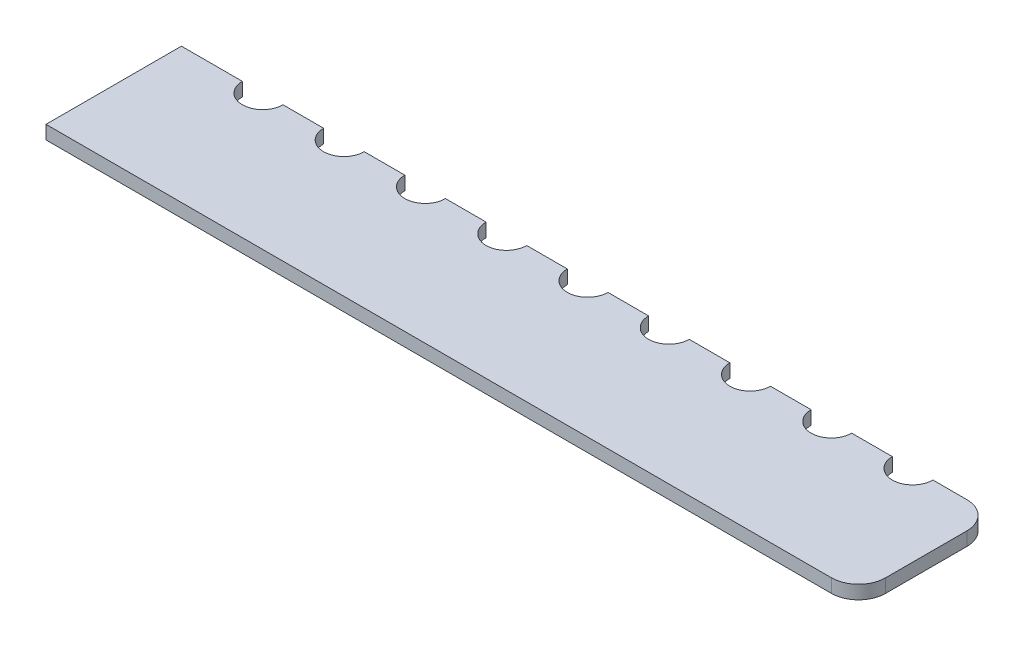
ISO-10303-21;
HEADER;
FILE_DESCRIPTION(('STEP AP214'),'2;1');
FILE_NAME('part.step','',(''),(''),'','','');
FILE_SCHEMA(('AUTOMOTIVE_DESIGN { 1 0 10303 214 1 1 1 1 }'));
ENDSEC;
DATA;
#1=APPLICATION_CONTEXT('core data for automotive mechanical design processes');
#2=APPLICATION_PROTOCOL_DEFINITION('international standard','automotive_design',2000,#1);
#3=PRODUCT_CONTEXT('',#1,'mechanical');
#4=PRODUCT('Part','Part','',(#3));
#5=PRODUCT_RELATED_PRODUCT_CATEGORY('part','',(#4));
#6=PRODUCT_DEFINITION_FORMATION('','',#4);
#7=PRODUCT_DEFINITION_CONTEXT('part definition',#1,'design');
#8=PRODUCT_DEFINITION('design','',#6,#7);
#9=PRODUCT_DEFINITION_SHAPE('','',#8);
#10=(LENGTH_UNIT() NAMED_UNIT(*) SI_UNIT(.MILLI.,.METRE.));
#11=(NAMED_UNIT(*) PLANE_ANGLE_UNIT() SI_UNIT($,.RADIAN.));
#12=(NAMED_UNIT(*) SI_UNIT($,.STERADIAN.) SOLID_ANGLE_UNIT());
#13=UNCERTAINTY_MEASURE_WITH_UNIT(LENGTH_MEASURE(1.E-05),#10,'distance_accuracy_value','');
#14=(GEOMETRIC_REPRESENTATION_CONTEXT(3) GLOBAL_UNCERTAINTY_ASSIGNED_CONTEXT((#13)) GLOBAL_UNIT_ASSIGNED_CONTEXT((#10,
#11,#12)) REPRESENTATION_CONTEXT('',''));
#15=CARTESIAN_POINT('',(0.,0.,0.));
#16=DIRECTION('',(0.,0.,1.));
#17=DIRECTION('',(1.,0.,0.));
#18=AXIS2_PLACEMENT_3D('',#15,#16,#17);
#19=CARTESIAN_POINT('',(0.,5.,-50.0000000000004));
#20=DIRECTION('',(0.,0.,1.00000000000001));
#21=DIRECTION('',(1.,0.,0.));
#22=AXIS2_PLACEMENT_3D('',#19,#20,#21);
#23=PLANE('',#22);
#24=DIRECTION('',(-1.,0.,0.));
#25=VECTOR('',#24,1.);
#26=CARTESIAN_POINT('',(0.,0.,-50.0000000000004));
#27=LINE('',#26,#25);
#28=CARTESIAN_POINT('',(-217.5,0.,-50.0000000000004));
#29=VERTEX_POINT('',#28);
#30=CARTESIAN_POINT('',(-232.5,0.,-50.0000000000004));
#31=VERTEX_POINT('',#30);
#32=EDGE_CURVE('E258',#29,#31,#27,.T.);
#33=ORIENTED_EDGE('',*,*,#32,.T.);
#34=DIRECTION('',(0.,1.,0.));
#35=VECTOR('',#34,1.);
#36=CARTESIAN_POINT('',(-232.5,0.,-50.0000000000004));
#37=LINE('',#36,#35);
#38=CARTESIAN_POINT('',(-232.5,4.99999999999999,-50.0000000000004));
#39=VERTEX_POINT('',#38);
#40=EDGE_CURVE('E292',#31,#39,#37,.T.);
#41=ORIENTED_EDGE('',*,*,#40,.T.);
#42=DIRECTION('',(-1.,0.,0.));
#43=VECTOR('',#42,1.);
#44=CARTESIAN_POINT('',(0.,5.,-50.0000000000004));
#45=LINE('',#44,#43);
#46=CARTESIAN_POINT('',(-217.5,5.,-50.0000000000004));
#47=VERTEX_POINT('',#46);
#48=EDGE_CURVE('E381',#47,#39,#45,.T.);
#49=ORIENTED_EDGE('',*,*,#48,.F.);
#50=DIRECTION('',(0.,1.,0.));
#51=VECTOR('',#50,1.);
#52=CARTESIAN_POINT('',(-217.5,0.,-50.0000000000004));
#53=LINE('',#52,#51);
#54=EDGE_CURVE('E304',#47,#29,#53,.F.);
#55=ORIENTED_EDGE('',*,*,#54,.T.);
#56=EDGE_LOOP('',(#33,#41,#49,#55));
#57=FACE_BOUND('',#56,.T.);
#58=ADVANCED_FACE('F39',(#57),#23,.F.);
#59=CARTESIAN_POINT('',(-187.5,0.,-50.0000000000004));
#60=VERTEX_POINT('',#59);
#61=CARTESIAN_POINT('',(-202.5,0.,-50.0000000000004));
#62=VERTEX_POINT('',#61);
#63=EDGE_CURVE('E437',#60,#62,#27,.T.);
#64=ORIENTED_EDGE('',*,*,#63,.T.);
#65=DIRECTION('',(0.,1.,0.));
#66=VECTOR('',#65,1.);
#67=CARTESIAN_POINT('',(-202.5,0.,-50.0000000000004));
#68=LINE('',#67,#66);
#69=CARTESIAN_POINT('',(-202.5,5.,-50.0000000000004));
#70=VERTEX_POINT('',#69);
#71=EDGE_CURVE('E300',#62,#70,#68,.T.);
#72=ORIENTED_EDGE('',*,*,#71,.T.);
#73=CARTESIAN_POINT('',(-187.5,5.,-50.0000000000004));
#74=VERTEX_POINT('',#73);
#75=EDGE_CURVE('E387',#74,#70,#45,.T.);
#76=ORIENTED_EDGE('',*,*,#75,.F.);
#77=DIRECTION('',(0.,1.,0.));
#78=VECTOR('',#77,1.);
#79=CARTESIAN_POINT('',(-187.5,0.,-50.0000000000004));
#80=LINE('',#79,#78);
#81=EDGE_CURVE('E312',#74,#60,#80,.F.);
#82=ORIENTED_EDGE('',*,*,#81,.T.);
#83=EDGE_LOOP('',(#64,#72,#76,#82));
#84=FACE_BOUND('',#83,.T.);
#85=ADVANCED_FACE('F523',(#84),#23,.F.);
#86=CARTESIAN_POINT('',(-157.5,0.,-50.0000000000004));
#87=VERTEX_POINT('',#86);
#88=CARTESIAN_POINT('',(-172.5,0.,-50.0000000000004));
#89=VERTEX_POINT('',#88);
#90=EDGE_CURVE('E428',#87,#89,#27,.T.);
#91=ORIENTED_EDGE('',*,*,#90,.T.);
#92=DIRECTION('',(0.,1.,0.));
#93=VECTOR('',#92,1.);
#94=CARTESIAN_POINT('',(-172.5,0.,-50.0000000000004));
#95=LINE('',#94,#93);
#96=CARTESIAN_POINT('',(-172.5,5.,-50.0000000000004));
#97=VERTEX_POINT('',#96);
#98=EDGE_CURVE('E308',#89,#97,#95,.T.);
#99=ORIENTED_EDGE('',*,*,#98,.T.);
#100=CARTESIAN_POINT('',(-157.5,5.,-50.0000000000004));
#101=VERTEX_POINT('',#100);
#102=EDGE_CURVE('E391',#101,#97,#45,.T.);
#103=ORIENTED_EDGE('',*,*,#102,.F.);
#104=DIRECTION('',(0.,1.,0.));
#105=VECTOR('',#104,1.);
#106=CARTESIAN_POINT('',(-157.5,0.,-50.0000000000004));
#107=LINE('',#106,#105);
#108=EDGE_CURVE('E320',#101,#87,#107,.F.);
#109=ORIENTED_EDGE('',*,*,#108,.T.);
#110=EDGE_LOOP('',(#91,#99,#103,#109));
#111=FACE_BOUND('',#110,.T.);
#112=ADVANCED_FACE('F426',(#111),#23,.F.);
#113=CARTESIAN_POINT('',(-127.5,0.,-50.0000000000004));
#114=VERTEX_POINT('',#113);
#115=CARTESIAN_POINT('',(-142.5,0.,-50.0000000000004));
#116=VERTEX_POINT('',#115);
#117=EDGE_CURVE('E506',#114,#116,#27,.T.);
#118=ORIENTED_EDGE('',*,*,#117,.T.);
#119=DIRECTION('',(0.,1.,0.));
#120=VECTOR('',#119,1.);
#121=CARTESIAN_POINT('',(-142.5,0.,-50.0000000000004));
#122=LINE('',#121,#120);
#123=CARTESIAN_POINT('',(-142.5,5.,-50.0000000000004));
#124=VERTEX_POINT('',#123);
#125=EDGE_CURVE('E316',#116,#124,#122,.T.);
#126=ORIENTED_EDGE('',*,*,#125,.T.);
#127=CARTESIAN_POINT('',(-127.5,5.,-50.0000000000004));
#128=VERTEX_POINT('',#127);
#129=EDGE_CURVE('E409',#128,#124,#45,.T.);
#130=ORIENTED_EDGE('',*,*,#129,.F.);
#131=DIRECTION('',(0.,1.,0.));
#132=VECTOR('',#131,1.);
#133=CARTESIAN_POINT('',(-127.5,0.,-50.0000000000004));
#134=LINE('',#133,#132);
#135=EDGE_CURVE('E328',#128,#114,#134,.F.);
#136=ORIENTED_EDGE('',*,*,#135,.T.);
#137=EDGE_LOOP('',(#118,#126,#130,#136));
#138=FACE_BOUND('',#137,.T.);
#139=ADVANCED_FACE('F685',(#138),#23,.F.);
#140=CARTESIAN_POINT('',(-97.5,0.,-50.0000000000004));
#141=VERTEX_POINT('',#140);
#142=CARTESIAN_POINT('',(-112.5,0.,-50.0000000000004));
#143=VERTEX_POINT('',#142);
#144=EDGE_CURVE('E245',#141,#143,#27,.T.);
#145=ORIENTED_EDGE('',*,*,#144,.T.);
#146=DIRECTION('',(0.,1.,0.));
#147=VECTOR('',#146,1.);
#148=CARTESIAN_POINT('',(-112.5,0.,-50.0000000000004));
#149=LINE('',#148,#147);
#150=CARTESIAN_POINT('',(-112.5,4.99999999999999,-50.0000000000004));
#151=VERTEX_POINT('',#150);
#152=EDGE_CURVE('E324',#143,#151,#149,.T.);
#153=ORIENTED_EDGE('',*,*,#152,.T.);
#154=CARTESIAN_POINT('',(-97.5,5.,-50.0000000000004));
#155=VERTEX_POINT('',#154);
#156=EDGE_CURVE('E403',#155,#151,#45,.T.);
#157=ORIENTED_EDGE('',*,*,#156,.F.);
#158=DIRECTION('',(0.,1.,0.));
#159=VECTOR('',#158,1.);
#160=CARTESIAN_POINT('',(-97.5,0.,-50.0000000000004));
#161=LINE('',#160,#159);
#162=EDGE_CURVE('E336',#155,#141,#161,.F.);
#163=ORIENTED_EDGE('',*,*,#162,.T.);
#164=EDGE_LOOP('',(#145,#153,#157,#163));
#165=FACE_BOUND('',#164,.T.);
#166=ADVANCED_FACE('F509',(#165),#23,.F.);
#167=CARTESIAN_POINT('',(-67.5000000000001,0.,-50.0000000000004));
#168=VERTEX_POINT('',#167);
#169=CARTESIAN_POINT('',(-82.5,0.,-50.0000000000004));
#170=VERTEX_POINT('',#169);
#171=EDGE_CURVE('E236',#168,#170,#27,.T.);
#172=ORIENTED_EDGE('',*,*,#171,.T.);
#173=DIRECTION('',(0.,1.,0.));
#174=VECTOR('',#173,1.);
#175=CARTESIAN_POINT('',(-82.5,0.,-50.0000000000004));
#176=LINE('',#175,#174);
#177=CARTESIAN_POINT('',(-82.5,5.,-50.0000000000004));
#178=VERTEX_POINT('',#177);
#179=EDGE_CURVE('E332',#170,#178,#176,.T.);
#180=ORIENTED_EDGE('',*,*,#179,.T.);
#181=CARTESIAN_POINT('',(-67.5000000000001,5.,-50.0000000000004));
#182=VERTEX_POINT('',#181);
#183=EDGE_CURVE('E398',#182,#178,#45,.T.);
#184=ORIENTED_EDGE('',*,*,#183,.F.);
#185=DIRECTION('',(0.,1.,0.));
#186=VECTOR('',#185,1.);
#187=CARTESIAN_POINT('',(-67.5000000000001,0.,-50.0000000000004));
#188=LINE('',#187,#186);
#189=EDGE_CURVE('E343',#182,#168,#188,.F.);
#190=ORIENTED_EDGE('',*,*,#189,.T.);
#191=EDGE_LOOP('',(#172,#180,#184,#190));
#192=FACE_BOUND('',#191,.T.);
#193=ADVANCED_FACE('F554',(#192),#23,.F.);
#194=CARTESIAN_POINT('',(-37.5,0.,-50.0000000000004));
#195=VERTEX_POINT('',#194);
#196=CARTESIAN_POINT('',(-52.5,0.,-50.0000000000004));
#197=VERTEX_POINT('',#196);
#198=EDGE_CURVE('E224',#195,#197,#27,.T.);
#199=ORIENTED_EDGE('',*,*,#198,.T.);
#200=DIRECTION('',(0.,1.,0.));
#201=VECTOR('',#200,1.);
#202=CARTESIAN_POINT('',(-52.5,0.,-50.0000000000004));
#203=LINE('',#202,#201);
#204=CARTESIAN_POINT('',(-52.5,5.,-50.0000000000004));
#205=VERTEX_POINT('',#204);
#206=EDGE_CURVE('E340',#197,#205,#203,.T.);
#207=ORIENTED_EDGE('',*,*,#206,.T.);
#208=CARTESIAN_POINT('',(-37.5,5.,-50.0000000000004));
#209=VERTEX_POINT('',#208);
#210=EDGE_CURVE('E226',#209,#205,#45,.T.);
#211=ORIENTED_EDGE('',*,*,#210,.F.);
#212=DIRECTION('',(0.,1.,0.));
#213=VECTOR('',#212,1.);
#214=CARTESIAN_POINT('',(-37.5,0.,-50.0000000000004));
#215=LINE('',#214,#213);
#216=EDGE_CURVE('E208',#209,#195,#215,.F.);
#217=ORIENTED_EDGE('',*,*,#216,.T.);
#218=EDGE_LOOP('',(#199,#207,#211,#217));
#219=FACE_BOUND('',#218,.T.);
#220=ADVANCED_FACE('F222',(#219),#23,.F.);
#221=CARTESIAN_POINT('',(-10.,5.,-50.0000000000004));
#222=VERTEX_POINT('',#221);
#223=CARTESIAN_POINT('',(-22.5,5.,-50.0000000000004));
#224=VERTEX_POINT('',#223);
#225=EDGE_CURVE('E277',#222,#224,#45,.T.);
#226=ORIENTED_EDGE('',*,*,#225,.F.);
#227=DIRECTION('',(0.,-1.,0.));
#228=VECTOR('',#227,1.);
#229=CARTESIAN_POINT('',(-10.,5.,-50.0000000000004));
#230=LINE('',#229,#228);
#231=CARTESIAN_POINT('',(-10.,0.,-50.0000000000004));
#232=VERTEX_POINT('',#231);
#233=EDGE_CURVE('E11',#222,#232,#230,.T.);
#234=ORIENTED_EDGE('',*,*,#233,.T.);
#235=CARTESIAN_POINT('',(-22.5,0.,-50.0000000000004));
#236=VERTEX_POINT('',#235);
#237=EDGE_CURVE('E235',#232,#236,#27,.T.);
#238=ORIENTED_EDGE('',*,*,#237,.T.);
#239=DIRECTION('',(0.,1.,0.));
#240=VECTOR('',#239,1.);
#241=CARTESIAN_POINT('',(-22.5,0.,-50.0000000000004));
#242=LINE('',#241,#240);
#243=EDGE_CURVE('E211',#236,#224,#242,.T.);
#244=ORIENTED_EDGE('',*,*,#243,.T.);
#245=EDGE_LOOP('',(#226,#234,#238,#244));
#246=FACE_BOUND('',#245,.T.);
#247=ADVANCED_FACE('F546',(#246),#23,.F.);
#248=CARTESIAN_POINT('',(-247.5,5.,-50.0000000000004));
#249=VERTEX_POINT('',#248);
#250=CARTESIAN_POINT('',(-262.5,5.,-50.0000000000004));
#251=VERTEX_POINT('',#250);
#252=EDGE_CURVE('E280',#249,#251,#45,.T.);
#253=ORIENTED_EDGE('',*,*,#252,.F.);
#254=DIRECTION('',(0.,1.,0.));
#255=VECTOR('',#254,1.);
#256=CARTESIAN_POINT('',(-247.5,0.,-50.0000000000004));
#257=LINE('',#256,#255);
#258=CARTESIAN_POINT('',(-247.5,0.,-50.0000000000004));
#259=VERTEX_POINT('',#258);
#260=EDGE_CURVE('E296',#249,#259,#257,.F.);
#261=ORIENTED_EDGE('',*,*,#260,.T.);
#262=CARTESIAN_POINT('',(-262.5,0.,-50.0000000000004));
#263=VERTEX_POINT('',#262);
#264=EDGE_CURVE('E243',#259,#263,#27,.T.);
#265=ORIENTED_EDGE('',*,*,#264,.T.);
#266=DIRECTION('',(0.,1.,0.));
#267=VECTOR('',#266,1.);
#268=CARTESIAN_POINT('',(-262.5,0.,-50.0000000000004));
#269=LINE('',#268,#267);
#270=EDGE_CURVE('E260',#263,#251,#269,.T.);
#271=ORIENTED_EDGE('',*,*,#270,.T.);
#272=EDGE_LOOP('',(#253,#261,#265,#271));
#273=FACE_BOUND('',#272,.T.);
#274=ADVANCED_FACE('F528',(#273),#23,.F.);
#275=CARTESIAN_POINT('',(0.,5.,0.));
#276=DIRECTION('',(-1.,0.,0.));
#277=DIRECTION('',(0.,0.,1.00000000000001));
#278=AXIS2_PLACEMENT_3D('',#275,#276,#277);
#279=PLANE('',#278);
#280=DIRECTION('',(0.,0.,-1.00000000000001));
#281=VECTOR('',#280,1.);
#282=CARTESIAN_POINT('',(0.,5.,0.));
#283=LINE('',#282,#281);
#284=CARTESIAN_POINT('',(0.,5.,-9.99999999999999));
#285=VERTEX_POINT('',#284);
#286=CARTESIAN_POINT('',(0.,5.,-40.0000000000004));
#287=VERTEX_POINT('',#286);
#288=EDGE_CURVE('E282',#285,#287,#283,.T.);
#289=ORIENTED_EDGE('',*,*,#288,.F.);
#290=DIRECTION('',(0.,-1.,0.));
#291=VECTOR('',#290,1.);
#292=CARTESIAN_POINT('',(0.,5.,-9.99999999999999));
#293=LINE('',#292,#291);
#294=CARTESIAN_POINT('',(0.,0.,-9.99999999999999));
#295=VERTEX_POINT('',#294);
#296=EDGE_CURVE('E456',#285,#295,#293,.T.);
#297=ORIENTED_EDGE('',*,*,#296,.T.);
#298=DIRECTION('',(0.,0.,-1.00000000000001));
#299=VECTOR('',#298,1.);
#300=CARTESIAN_POINT('',(0.,0.,0.));
#301=LINE('',#300,#299);
#302=CARTESIAN_POINT('',(0.,0.,-40.0000000000004));
#303=VERTEX_POINT('',#302);
#304=EDGE_CURVE('E249',#295,#303,#301,.T.);
#305=ORIENTED_EDGE('',*,*,#304,.T.);
#306=DIRECTION('',(0.,-1.,0.));
#307=VECTOR('',#306,1.);
#308=CARTESIAN_POINT('',(0.,5.,-40.0000000000004));
#309=LINE('',#308,#307);
#310=EDGE_CURVE('E453',#303,#287,#309,.F.);
#311=ORIENTED_EDGE('',*,*,#310,.T.);
#312=EDGE_LOOP('',(#289,#297,#305,#311));
#313=FACE_BOUND('',#312,.T.);
#314=ADVANCED_FACE('F474',(#313),#279,.F.);
#315=CARTESIAN_POINT('',(-277.5,5.,-50.0000000000004));
#316=VERTEX_POINT('',#315);
#317=CARTESIAN_POINT('',(-300.,5.,-50.0000000000004));
#318=VERTEX_POINT('',#317);
#319=EDGE_CURVE('E281',#316,#318,#45,.T.);
#320=ORIENTED_EDGE('',*,*,#319,.F.);
#321=DIRECTION('',(0.,1.,0.));
#322=VECTOR('',#321,1.);
#323=CARTESIAN_POINT('',(-277.5,0.,-50.0000000000004));
#324=LINE('',#323,#322);
#325=CARTESIAN_POINT('',(-277.5,0.,-50.0000000000004));
#326=VERTEX_POINT('',#325);
#327=EDGE_CURVE('E267',#316,#326,#324,.F.);
#328=ORIENTED_EDGE('',*,*,#327,.T.);
#329=CARTESIAN_POINT('',(-300.,0.,-50.0000000000004));
#330=VERTEX_POINT('',#329);
#331=EDGE_CURVE('E238',#326,#330,#27,.T.);
#332=ORIENTED_EDGE('',*,*,#331,.T.);
#333=DIRECTION('',(0.,-1.,0.));
#334=VECTOR('',#333,1.);
#335=CARTESIAN_POINT('',(-300.,5.,-50.0000000000004));
#336=LINE('',#335,#334);
#337=EDGE_CURVE('E488',#318,#330,#336,.T.);
#338=ORIENTED_EDGE('',*,*,#337,.F.);
#339=EDGE_LOOP('',(#320,#328,#332,#338));
#340=FACE_BOUND('',#339,.T.);
#341=ADVANCED_FACE('F535',(#340),#23,.F.);
#342=CARTESIAN_POINT('',(-300.,5.,0.));
#343=DIRECTION('',(1.,0.,0.));
#344=DIRECTION('',(0.,0.,-1.00000000000001));
#345=AXIS2_PLACEMENT_3D('',#342,#343,#344);
#346=PLANE('',#345);
#347=DIRECTION('',(0.,0.,1.00000000000001));
#348=VECTOR('',#347,1.);
#349=CARTESIAN_POINT('',(-300.,0.,0.));
#350=LINE('',#349,#348);
#351=CARTESIAN_POINT('',(-300.,0.,0.));
#352=VERTEX_POINT('',#351);
#353=EDGE_CURVE('E242',#330,#352,#350,.T.);
#354=ORIENTED_EDGE('',*,*,#353,.T.);
#355=DIRECTION('',(0.,-1.,0.));
#356=VECTOR('',#355,1.);
#357=CARTESIAN_POINT('',(-300.,5.,0.));
#358=LINE('',#357,#356);
#359=CARTESIAN_POINT('',(-300.,5.,0.));
#360=VERTEX_POINT('',#359);
#361=EDGE_CURVE('E273',#360,#352,#358,.T.);
#362=ORIENTED_EDGE('',*,*,#361,.F.);
#363=DIRECTION('',(0.,0.,1.00000000000001));
#364=VECTOR('',#363,1.);
#365=CARTESIAN_POINT('',(-300.,5.,0.));
#366=LINE('',#365,#364);
#367=EDGE_CURVE('E274',#318,#360,#366,.T.);
#368=ORIENTED_EDGE('',*,*,#367,.F.);
#369=ORIENTED_EDGE('',*,*,#337,.T.);
#370=EDGE_LOOP('',(#354,#362,#368,#369));
#371=FACE_BOUND('',#370,.T.);
#372=ADVANCED_FACE('F533',(#371),#346,.F.);
#373=CARTESIAN_POINT('',(0.,5.,0.));
#374=DIRECTION('',(0.,0.,-1.00000000000001));
#375=DIRECTION('',(-1.,0.,0.));
#376=AXIS2_PLACEMENT_3D('',#373,#374,#375);
#377=PLANE('',#376);
#378=DIRECTION('',(1.,0.,0.));
#379=VECTOR('',#378,1.);
#380=CARTESIAN_POINT('',(0.,0.,0.));
#381=LINE('',#380,#379);
#382=CARTESIAN_POINT('',(-10.,0.,0.));
#383=VERTEX_POINT('',#382);
#384=EDGE_CURVE('E284',#352,#383,#381,.T.);
#385=ORIENTED_EDGE('',*,*,#384,.T.);
#386=DIRECTION('',(0.,-1.,0.));
#387=VECTOR('',#386,1.);
#388=CARTESIAN_POINT('',(-10.,5.,0.));
#389=LINE('',#388,#387);
#390=CARTESIAN_POINT('',(-10.,5.,0.));
#391=VERTEX_POINT('',#390);
#392=EDGE_CURVE('E63',#383,#391,#389,.F.);
#393=ORIENTED_EDGE('',*,*,#392,.T.);
#394=DIRECTION('',(1.,0.,0.));
#395=VECTOR('',#394,1.);
#396=CARTESIAN_POINT('',(0.,5.,0.));
#397=LINE('',#396,#395);
#398=EDGE_CURVE('E270',#360,#391,#397,.T.);
#399=ORIENTED_EDGE('',*,*,#398,.F.);
#400=ORIENTED_EDGE('',*,*,#361,.T.);
#401=EDGE_LOOP('',(#385,#393,#399,#400));
#402=FACE_BOUND('',#401,.T.);
#403=ADVANCED_FACE('F479',(#402),#377,.F.);
#404=CARTESIAN_POINT('',(0.,5.,0.));
#405=DIRECTION('',(0.,1.,0.));
#406=DIRECTION('',(0.,0.,1.00000000000001));
#407=AXIS2_PLACEMENT_3D('',#404,#405,#406);
#408=PLANE('',#407);
#409=ORIENTED_EDGE('',*,*,#398,.T.);
#410=CARTESIAN_POINT('',(-10.,5.,-9.99999999999999));
#411=DIRECTION('',(0.,1.,0.));
#412=DIRECTION('',(0.,0.,1.00000000000001));
#413=AXIS2_PLACEMENT_3D('',#410,#411,#412);
#414=CIRCLE('',#413,10.);
#415=EDGE_CURVE('E48',#391,#285,#414,.T.);
#416=ORIENTED_EDGE('',*,*,#415,.T.);
#417=ORIENTED_EDGE('',*,*,#288,.T.);
#418=CARTESIAN_POINT('',(-10.,5.,-40.0000000000004));
#419=DIRECTION('',(0.,1.,0.));
#420=DIRECTION('',(0.,0.,1.00000000000001));
#421=AXIS2_PLACEMENT_3D('',#418,#419,#420);
#422=CIRCLE('',#421,10.);
#423=EDGE_CURVE('E55',#287,#222,#422,.T.);
#424=ORIENTED_EDGE('',*,*,#423,.T.);
#425=ORIENTED_EDGE('',*,*,#225,.T.);
#426=CARTESIAN_POINT('',(-30.,5.,-50.0000000000004));
#427=DIRECTION('',(0.,1.,0.));
#428=DIRECTION('',(0.,0.,1.00000000000001));
#429=AXIS2_PLACEMENT_3D('',#426,#427,#428);
#430=CIRCLE('',#429,7.50000000000001);
#431=EDGE_CURVE('E349',#209,#224,#430,.T.);
#432=ORIENTED_EDGE('',*,*,#431,.F.);
#433=ORIENTED_EDGE('',*,*,#210,.T.);
#434=CARTESIAN_POINT('',(-60.,5.,-50.0000000000004));
#435=DIRECTION('',(0.,1.,0.));
#436=DIRECTION('',(0.,0.,1.00000000000001));
#437=AXIS2_PLACEMENT_3D('',#434,#435,#436);
#438=CIRCLE('',#437,7.50000000000001);
#439=EDGE_CURVE('E352',#182,#205,#438,.T.);
#440=ORIENTED_EDGE('',*,*,#439,.F.);
#441=ORIENTED_EDGE('',*,*,#183,.T.);
#442=CARTESIAN_POINT('',(-90.,5.,-50.0000000000004));
#443=DIRECTION('',(0.,1.,0.));
#444=DIRECTION('',(0.,0.,1.00000000000001));
#445=AXIS2_PLACEMENT_3D('',#442,#443,#444);
#446=CIRCLE('',#445,7.50000000000001);
#447=EDGE_CURVE('E355',#155,#178,#446,.T.);
#448=ORIENTED_EDGE('',*,*,#447,.F.);
#449=ORIENTED_EDGE('',*,*,#156,.T.);
#450=CARTESIAN_POINT('',(-120.,5.,-50.0000000000004));
#451=DIRECTION('',(0.,1.,0.));
#452=DIRECTION('',(0.,0.,1.00000000000001));
#453=AXIS2_PLACEMENT_3D('',#450,#451,#452);
#454=CIRCLE('',#453,7.50000000000001);
#455=EDGE_CURVE('E358',#128,#151,#454,.T.);
#456=ORIENTED_EDGE('',*,*,#455,.F.);
#457=ORIENTED_EDGE('',*,*,#129,.T.);
#458=CARTESIAN_POINT('',(-150.,5.,-50.0000000000004));
#459=DIRECTION('',(0.,1.,0.));
#460=DIRECTION('',(0.,0.,1.00000000000001));
#461=AXIS2_PLACEMENT_3D('',#458,#459,#460);
#462=CIRCLE('',#461,7.50000000000001);
#463=EDGE_CURVE('E361',#101,#124,#462,.T.);
#464=ORIENTED_EDGE('',*,*,#463,.F.);
#465=ORIENTED_EDGE('',*,*,#102,.T.);
#466=CARTESIAN_POINT('',(-180.,5.,-50.0000000000004));
#467=DIRECTION('',(0.,1.,0.));
#468=DIRECTION('',(0.,0.,1.00000000000001));
#469=AXIS2_PLACEMENT_3D('',#466,#467,#468);
#470=CIRCLE('',#469,7.50000000000001);
#471=EDGE_CURVE('E364',#74,#97,#470,.T.);
#472=ORIENTED_EDGE('',*,*,#471,.F.);
#473=ORIENTED_EDGE('',*,*,#75,.T.);
#474=CARTESIAN_POINT('',(-210.,5.,-50.0000000000004));
#475=DIRECTION('',(0.,1.,0.));
#476=DIRECTION('',(0.,0.,1.00000000000001));
#477=AXIS2_PLACEMENT_3D('',#474,#475,#476);
#478=CIRCLE('',#477,7.50000000000001);
#479=EDGE_CURVE('E367',#47,#70,#478,.T.);
#480=ORIENTED_EDGE('',*,*,#479,.F.);
#481=ORIENTED_EDGE('',*,*,#48,.T.);
#482=CARTESIAN_POINT('',(-240.,4.99999999999999,-50.0000000000004));
#483=DIRECTION('',(0.,1.,0.));
#484=DIRECTION('',(0.,0.,1.00000000000001));
#485=AXIS2_PLACEMENT_3D('',#482,#483,#484);
#486=CIRCLE('',#485,7.50000000000001);
#487=EDGE_CURVE('E228',#249,#39,#486,.T.);
#488=ORIENTED_EDGE('',*,*,#487,.F.);
#489=ORIENTED_EDGE('',*,*,#252,.T.);
#490=CARTESIAN_POINT('',(-270.,5.,-50.0000000000004));
#491=DIRECTION('',(0.,1.,0.));
#492=DIRECTION('',(0.,0.,1.00000000000001));
#493=AXIS2_PLACEMENT_3D('',#490,#491,#492);
#494=CIRCLE('',#493,7.50000000000001);
#495=EDGE_CURVE('E288',#316,#251,#494,.T.);
#496=ORIENTED_EDGE('',*,*,#495,.F.);
#497=ORIENTED_EDGE('',*,*,#319,.T.);
#498=ORIENTED_EDGE('',*,*,#367,.T.);
#499=EDGE_LOOP('',(#409,#416,#417,#424,#425,#432,#433,#440,#441,#448,#449,#456,#457,#464,#465,
#472,#473,#480,#481,#488,#489,#496,#497,#498));
#500=FACE_BOUND('',#499,.T.);
#501=ADVANCED_FACE('F384',(#500),#408,.T.);
#502=CARTESIAN_POINT('',(0.,0.,0.));
#503=DIRECTION('',(0.,1.,0.));
#504=DIRECTION('',(0.,0.,1.00000000000001));
#505=AXIS2_PLACEMENT_3D('',#502,#503,#504);
#506=PLANE('',#505);
#507=ORIENTED_EDGE('',*,*,#304,.F.);
#508=CARTESIAN_POINT('',(-10.,0.,-9.99999999999999));
#509=DIRECTION('',(0.,1.,0.));
#510=DIRECTION('',(0.,0.,1.00000000000001));
#511=AXIS2_PLACEMENT_3D('',#508,#509,#510);
#512=CIRCLE('',#511,10.);
#513=EDGE_CURVE('E462',#295,#383,#512,.F.);
#514=ORIENTED_EDGE('',*,*,#513,.T.);
#515=ORIENTED_EDGE('',*,*,#384,.F.);
#516=ORIENTED_EDGE('',*,*,#353,.F.);
#517=ORIENTED_EDGE('',*,*,#331,.F.);
#518=CARTESIAN_POINT('',(-270.,0.,-50.0000000000004));
#519=DIRECTION('',(0.,1.,0.));
#520=DIRECTION('',(0.,0.,1.00000000000001));
#521=AXIS2_PLACEMENT_3D('',#518,#519,#520);
#522=CIRCLE('',#521,7.50000000000001);
#523=EDGE_CURVE('E217',#326,#263,#522,.T.);
#524=ORIENTED_EDGE('',*,*,#523,.T.);
#525=ORIENTED_EDGE('',*,*,#264,.F.);
#526=CARTESIAN_POINT('',(-240.,0.,-50.0000000000004));
#527=DIRECTION('',(0.,1.,0.));
#528=DIRECTION('',(0.,0.,1.00000000000001));
#529=AXIS2_PLACEMENT_3D('',#526,#527,#528);
#530=CIRCLE('',#529,7.50000000000001);
#531=EDGE_CURVE('E445',#259,#31,#530,.T.);
#532=ORIENTED_EDGE('',*,*,#531,.T.);
#533=ORIENTED_EDGE('',*,*,#32,.F.);
#534=CARTESIAN_POINT('',(-210.,0.,-50.0000000000004));
#535=DIRECTION('',(0.,1.,0.));
#536=DIRECTION('',(0.,0.,1.00000000000001));
#537=AXIS2_PLACEMENT_3D('',#534,#535,#536);
#538=CIRCLE('',#537,7.50000000000001);
#539=EDGE_CURVE('E439',#29,#62,#538,.T.);
#540=ORIENTED_EDGE('',*,*,#539,.T.);
#541=ORIENTED_EDGE('',*,*,#63,.F.);
#542=CARTESIAN_POINT('',(-180.,0.,-50.0000000000004));
#543=DIRECTION('',(0.,1.,0.));
#544=DIRECTION('',(0.,0.,1.00000000000001));
#545=AXIS2_PLACEMENT_3D('',#542,#543,#544);
#546=CIRCLE('',#545,7.50000000000001);
#547=EDGE_CURVE('E432',#60,#89,#546,.T.);
#548=ORIENTED_EDGE('',*,*,#547,.T.);
#549=ORIENTED_EDGE('',*,*,#90,.F.);
#550=CARTESIAN_POINT('',(-150.,0.,-50.0000000000004));
#551=DIRECTION('',(0.,1.,0.));
#552=DIRECTION('',(0.,0.,1.00000000000001));
#553=AXIS2_PLACEMENT_3D('',#550,#551,#552);
#554=CIRCLE('',#553,7.50000000000001);
#555=EDGE_CURVE('E440',#87,#116,#554,.T.);
#556=ORIENTED_EDGE('',*,*,#555,.T.);
#557=ORIENTED_EDGE('',*,*,#117,.F.);
#558=CARTESIAN_POINT('',(-120.,0.,-50.0000000000004));
#559=DIRECTION('',(0.,1.,0.));
#560=DIRECTION('',(0.,0.,1.00000000000001));
#561=AXIS2_PLACEMENT_3D('',#558,#559,#560);
#562=CIRCLE('',#561,7.50000000000001);
#563=EDGE_CURVE('E447',#114,#143,#562,.T.);
#564=ORIENTED_EDGE('',*,*,#563,.T.);
#565=ORIENTED_EDGE('',*,*,#144,.F.);
#566=CARTESIAN_POINT('',(-90.,0.,-50.0000000000004));
#567=DIRECTION('',(0.,1.,0.));
#568=DIRECTION('',(0.,0.,1.00000000000001));
#569=AXIS2_PLACEMENT_3D('',#566,#567,#568);
#570=CIRCLE('',#569,7.50000000000001);
#571=EDGE_CURVE('E496',#141,#170,#570,.T.);
#572=ORIENTED_EDGE('',*,*,#571,.T.);
#573=ORIENTED_EDGE('',*,*,#171,.F.);
#574=CARTESIAN_POINT('',(-60.,0.,-50.0000000000004));
#575=DIRECTION('',(0.,1.,0.));
#576=DIRECTION('',(0.,0.,1.00000000000001));
#577=AXIS2_PLACEMENT_3D('',#574,#575,#576);
#578=CIRCLE('',#577,7.50000000000001);
#579=EDGE_CURVE('E216',#168,#197,#578,.T.);
#580=ORIENTED_EDGE('',*,*,#579,.T.);
#581=ORIENTED_EDGE('',*,*,#198,.F.);
#582=CARTESIAN_POINT('',(-30.,0.,-50.0000000000004));
#583=DIRECTION('',(0.,1.,0.));
#584=DIRECTION('',(0.,0.,1.00000000000001));
#585=AXIS2_PLACEMENT_3D('',#582,#583,#584);
#586=CIRCLE('',#585,7.50000000000001);
#587=EDGE_CURVE('E204',#195,#236,#586,.T.);
#588=ORIENTED_EDGE('',*,*,#587,.T.);
#589=ORIENTED_EDGE('',*,*,#237,.F.);
#590=CARTESIAN_POINT('',(-10.,0.,-40.0000000000004));
#591=DIRECTION('',(0.,1.,0.));
#592=DIRECTION('',(0.,0.,1.00000000000001));
#593=AXIS2_PLACEMENT_3D('',#590,#591,#592);
#594=CIRCLE('',#593,10.);
#595=EDGE_CURVE('E459',#232,#303,#594,.F.);
#596=ORIENTED_EDGE('',*,*,#595,.T.);
#597=EDGE_LOOP('',(#507,#514,#515,#516,#517,#524,#525,#532,#533,#540,#541,#548,#549,#556,#557,
#564,#565,#572,#573,#580,#581,#588,#589,#596));
#598=FACE_BOUND('',#597,.T.);
#599=ADVANCED_FACE('F232',(#598),#506,.F.);
#600=CARTESIAN_POINT('',(-270.,0.,-50.0000000000004));
#601=DIRECTION('',(0.,1.,0.));
#602=DIRECTION('',(0.,0.,1.00000000000001));
#603=AXIS2_PLACEMENT_3D('',#600,#601,#602);
#604=CYLINDRICAL_SURFACE('',#603,7.50000000000001);
#605=ORIENTED_EDGE('',*,*,#523,.F.);
#606=ORIENTED_EDGE('',*,*,#327,.F.);
#607=ORIENTED_EDGE('',*,*,#495,.T.);
#608=ORIENTED_EDGE('',*,*,#270,.F.);
#609=EDGE_LOOP('',(#605,#606,#607,#608));
#610=FACE_BOUND('',#609,.T.);
#611=ADVANCED_FACE('F531',(#610),#604,.F.);
#612=CARTESIAN_POINT('',(-30.,0.,-50.0000000000004));
#613=DIRECTION('',(0.,1.,0.));
#614=DIRECTION('',(0.,0.,1.00000000000001));
#615=AXIS2_PLACEMENT_3D('',#612,#613,#614);
#616=CYLINDRICAL_SURFACE('',#615,7.50000000000001);
#617=ORIENTED_EDGE('',*,*,#587,.F.);
#618=ORIENTED_EDGE('',*,*,#216,.F.);
#619=ORIENTED_EDGE('',*,*,#431,.T.);
#620=ORIENTED_EDGE('',*,*,#243,.F.);
#621=EDGE_LOOP('',(#617,#618,#619,#620));
#622=FACE_BOUND('',#621,.T.);
#623=ADVANCED_FACE('F206',(#622),#616,.F.);
#624=CARTESIAN_POINT('',(-60.,0.,-50.0000000000004));
#625=DIRECTION('',(0.,1.,0.));
#626=DIRECTION('',(0.,0.,1.00000000000001));
#627=AXIS2_PLACEMENT_3D('',#624,#625,#626);
#628=CYLINDRICAL_SURFACE('',#627,7.50000000000001);
#629=ORIENTED_EDGE('',*,*,#579,.F.);
#630=ORIENTED_EDGE('',*,*,#189,.F.);
#631=ORIENTED_EDGE('',*,*,#439,.T.);
#632=ORIENTED_EDGE('',*,*,#206,.F.);
#633=EDGE_LOOP('',(#629,#630,#631,#632));
#634=FACE_BOUND('',#633,.T.);
#635=ADVANCED_FACE('F582',(#634),#628,.F.);
#636=CARTESIAN_POINT('',(-90.,0.,-50.0000000000004));
#637=DIRECTION('',(0.,1.,0.));
#638=DIRECTION('',(0.,0.,1.00000000000001));
#639=AXIS2_PLACEMENT_3D('',#636,#637,#638);
#640=CYLINDRICAL_SURFACE('',#639,7.50000000000001);
#641=ORIENTED_EDGE('',*,*,#571,.F.);
#642=ORIENTED_EDGE('',*,*,#162,.F.);
#643=ORIENTED_EDGE('',*,*,#447,.T.);
#644=ORIENTED_EDGE('',*,*,#179,.F.);
#645=EDGE_LOOP('',(#641,#642,#643,#644));
#646=FACE_BOUND('',#645,.T.);
#647=ADVANCED_FACE('F579',(#646),#640,.F.);
#648=CARTESIAN_POINT('',(-120.,0.,-50.0000000000004));
#649=DIRECTION('',(0.,1.,0.));
#650=DIRECTION('',(0.,0.,1.00000000000001));
#651=AXIS2_PLACEMENT_3D('',#648,#649,#650);
#652=CYLINDRICAL_SURFACE('',#651,7.50000000000001);
#653=ORIENTED_EDGE('',*,*,#563,.F.);
#654=ORIENTED_EDGE('',*,*,#135,.F.);
#655=ORIENTED_EDGE('',*,*,#455,.T.);
#656=ORIENTED_EDGE('',*,*,#152,.F.);
#657=EDGE_LOOP('',(#653,#654,#655,#656));
#658=FACE_BOUND('',#657,.T.);
#659=ADVANCED_FACE('F575',(#658),#652,.F.);
#660=CARTESIAN_POINT('',(-150.,0.,-50.0000000000004));
#661=DIRECTION('',(0.,1.,0.));
#662=DIRECTION('',(0.,0.,1.00000000000001));
#663=AXIS2_PLACEMENT_3D('',#660,#661,#662);
#664=CYLINDRICAL_SURFACE('',#663,7.50000000000001);
#665=ORIENTED_EDGE('',*,*,#555,.F.);
#666=ORIENTED_EDGE('',*,*,#108,.F.);
#667=ORIENTED_EDGE('',*,*,#463,.T.);
#668=ORIENTED_EDGE('',*,*,#125,.F.);
#669=EDGE_LOOP('',(#665,#666,#667,#668));
#670=FACE_BOUND('',#669,.T.);
#671=ADVANCED_FACE('F572',(#670),#664,.F.);
#672=CARTESIAN_POINT('',(-180.,0.,-50.0000000000004));
#673=DIRECTION('',(0.,1.,0.));
#674=DIRECTION('',(0.,0.,1.00000000000001));
#675=AXIS2_PLACEMENT_3D('',#672,#673,#674);
#676=CYLINDRICAL_SURFACE('',#675,7.50000000000001);
#677=ORIENTED_EDGE('',*,*,#547,.F.);
#678=ORIENTED_EDGE('',*,*,#81,.F.);
#679=ORIENTED_EDGE('',*,*,#471,.T.);
#680=ORIENTED_EDGE('',*,*,#98,.F.);
#681=EDGE_LOOP('',(#677,#678,#679,#680));
#682=FACE_BOUND('',#681,.T.);
#683=ADVANCED_FACE('F431',(#682),#676,.F.);
#684=CARTESIAN_POINT('',(-210.,0.,-50.0000000000004));
#685=DIRECTION('',(0.,1.,0.));
#686=DIRECTION('',(0.,0.,1.00000000000001));
#687=AXIS2_PLACEMENT_3D('',#684,#685,#686);
#688=CYLINDRICAL_SURFACE('',#687,7.50000000000001);
#689=ORIENTED_EDGE('',*,*,#539,.F.);
#690=ORIENTED_EDGE('',*,*,#54,.F.);
#691=ORIENTED_EDGE('',*,*,#479,.T.);
#692=ORIENTED_EDGE('',*,*,#71,.F.);
#693=EDGE_LOOP('',(#689,#690,#691,#692));
#694=FACE_BOUND('',#693,.T.);
#695=ADVANCED_FACE('F525',(#694),#688,.F.);
#696=CARTESIAN_POINT('',(-240.,0.,-50.0000000000004));
#697=DIRECTION('',(0.,1.,0.));
#698=DIRECTION('',(0.,0.,1.00000000000001));
#699=AXIS2_PLACEMENT_3D('',#696,#697,#698);
#700=CYLINDRICAL_SURFACE('',#699,7.50000000000001);
#701=ORIENTED_EDGE('',*,*,#531,.F.);
#702=ORIENTED_EDGE('',*,*,#260,.F.);
#703=ORIENTED_EDGE('',*,*,#487,.T.);
#704=ORIENTED_EDGE('',*,*,#40,.F.);
#705=EDGE_LOOP('',(#701,#702,#703,#704));
#706=FACE_BOUND('',#705,.T.);
#707=ADVANCED_FACE('F374',(#706),#700,.F.);
#708=CARTESIAN_POINT('',(-10.,5.,-9.99999999999999));
#709=DIRECTION('',(0.,-1.,0.));
#710=DIRECTION('',(0.,0.,-1.00000000000001));
#711=AXIS2_PLACEMENT_3D('',#708,#709,#710);
#712=CYLINDRICAL_SURFACE('',#711,10.);
#713=ORIENTED_EDGE('',*,*,#415,.F.);
#714=ORIENTED_EDGE('',*,*,#392,.F.);
#715=ORIENTED_EDGE('',*,*,#513,.F.);
#716=ORIENTED_EDGE('',*,*,#296,.F.);
#717=EDGE_LOOP('',(#713,#714,#715,#716));
#718=FACE_BOUND('',#717,.T.);
#719=ADVANCED_FACE('F475',(#718),#712,.T.);
#720=CARTESIAN_POINT('',(-10.,5.,-40.0000000000004));
#721=DIRECTION('',(0.,-1.,0.));
#722=DIRECTION('',(0.,0.,-1.00000000000001));
#723=AXIS2_PLACEMENT_3D('',#720,#721,#722);
#724=CYLINDRICAL_SURFACE('',#723,10.);
#725=ORIENTED_EDGE('',*,*,#423,.F.);
#726=ORIENTED_EDGE('',*,*,#310,.F.);
#727=ORIENTED_EDGE('',*,*,#595,.F.);
#728=ORIENTED_EDGE('',*,*,#233,.F.);
#729=EDGE_LOOP('',(#725,#726,#727,#728));
#730=FACE_BOUND('',#729,.T.);
#731=ADVANCED_FACE('F41',(#730),#724,.T.);
#732=CLOSED_SHELL('',(#58,#85,#112,#139,#166,#193,#220,#247,#274,#314,#341,#372,#403,#501,#599,
#611,#623,#635,#647,#659,#671,#683,#695,#707,#719,#731));
#733=MANIFOLD_SOLID_BREP('B2',#732);
#734=ADVANCED_BREP_SHAPE_REPRESENTATION('',(#18,#733),#14);
#735=SHAPE_DEFINITION_REPRESENTATION(#9,#734);
ENDSEC;
END-ISO-10303-21;
